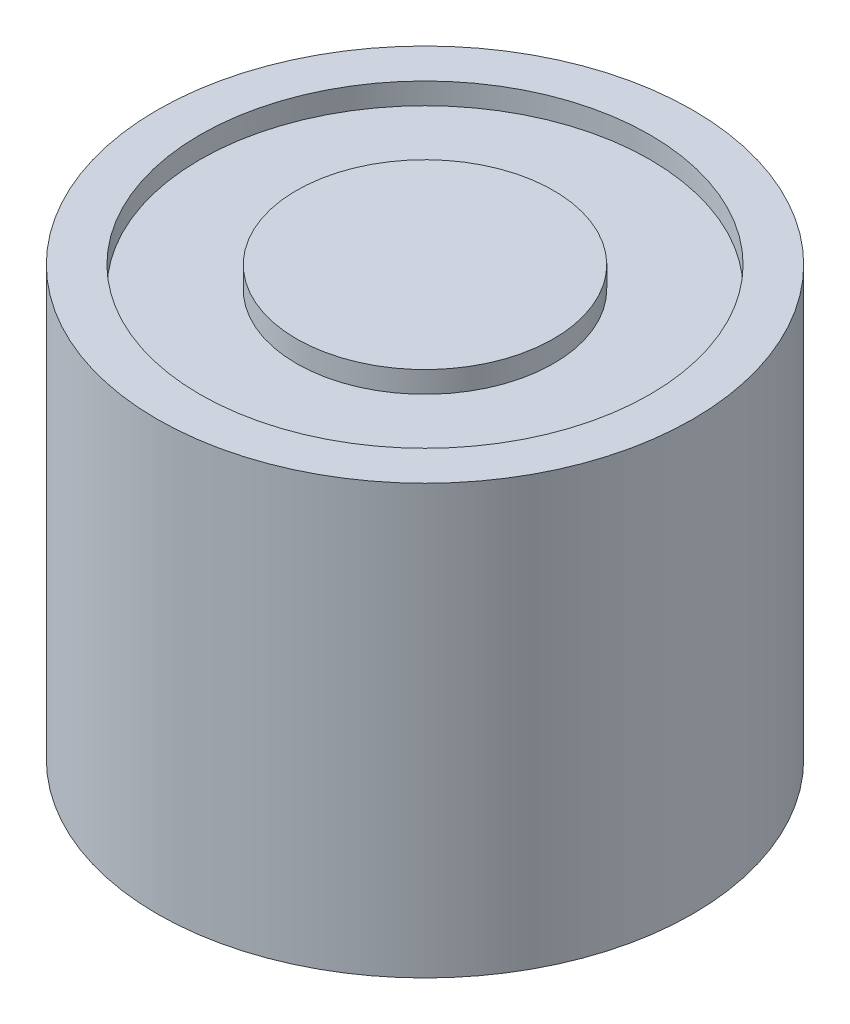
ISO-10303-21;
HEADER;
FILE_DESCRIPTION(('STEP AP214'),'2;1');
FILE_NAME('part.step','',(''),(''),'','','');
FILE_SCHEMA(('AUTOMOTIVE_DESIGN { 1 0 10303 214 1 1 1 1 }'));
ENDSEC;
DATA;
#1=APPLICATION_CONTEXT('core data for automotive mechanical design processes');
#2=APPLICATION_PROTOCOL_DEFINITION('international standard','automotive_design',2000,#1);
#3=PRODUCT_CONTEXT('',#1,'mechanical');
#4=PRODUCT('Part','Part','',(#3));
#5=PRODUCT_RELATED_PRODUCT_CATEGORY('part','',(#4));
#6=PRODUCT_DEFINITION_FORMATION('','',#4);
#7=PRODUCT_DEFINITION_CONTEXT('part definition',#1,'design');
#8=PRODUCT_DEFINITION('design','',#6,#7);
#9=PRODUCT_DEFINITION_SHAPE('','',#8);
#10=(LENGTH_UNIT() NAMED_UNIT(*) SI_UNIT(.MILLI.,.METRE.));
#11=(NAMED_UNIT(*) PLANE_ANGLE_UNIT() SI_UNIT($,.RADIAN.));
#12=(NAMED_UNIT(*) SI_UNIT($,.STERADIAN.) SOLID_ANGLE_UNIT());
#13=UNCERTAINTY_MEASURE_WITH_UNIT(LENGTH_MEASURE(1.E-05),#10,'distance_accuracy_value','');
#14=(GEOMETRIC_REPRESENTATION_CONTEXT(3) GLOBAL_UNCERTAINTY_ASSIGNED_CONTEXT((#13)) GLOBAL_UNIT_ASSIGNED_CONTEXT((#10,
#11,#12)) REPRESENTATION_CONTEXT('',''));
#15=CARTESIAN_POINT('',(0.,0.,0.));
#16=DIRECTION('',(0.,0.,1.));
#17=DIRECTION('',(1.,0.,0.));
#18=AXIS2_PLACEMENT_3D('',#15,#16,#17);
#19=CARTESIAN_POINT('',(0.,20.,0.));
#20=DIRECTION('',(0.,-1.,0.));
#21=DIRECTION('',(0.,0.,-1.));
#22=AXIS2_PLACEMENT_3D('',#19,#20,#21);
#23=CYLINDRICAL_SURFACE('',#22,12.5);
#24=CARTESIAN_POINT('',(0.,20.,0.));
#25=DIRECTION('',(0.,1.,0.));
#26=DIRECTION('',(0.,0.,1.));
#27=AXIS2_PLACEMENT_3D('',#24,#25,#26);
#28=CIRCLE('',#27,12.5);
#29=CARTESIAN_POINT('',(0.,20.,12.5));
#30=VERTEX_POINT('',#29);
#31=EDGE_CURVE('E10',#30,#30,#28,.T.);
#32=ORIENTED_EDGE('',*,*,#31,.F.);
#33=EDGE_LOOP('',(#32));
#34=FACE_BOUND('',#33,.T.);
#35=CARTESIAN_POINT('',(0.,0.,0.));
#36=DIRECTION('',(0.,1.,0.));
#37=DIRECTION('',(0.,0.,1.));
#38=AXIS2_PLACEMENT_3D('',#35,#36,#37);
#39=CIRCLE('',#38,12.5);
#40=CARTESIAN_POINT('',(0.,0.,12.5));
#41=VERTEX_POINT('',#40);
#42=EDGE_CURVE('E38',#41,#41,#39,.T.);
#43=ORIENTED_EDGE('',*,*,#42,.T.);
#44=EDGE_LOOP('',(#43));
#45=FACE_BOUND('',#44,.T.);
#46=ADVANCED_FACE('F35',(#34,#45),#23,.T.);
#47=CARTESIAN_POINT('',(0.,20.,0.));
#48=DIRECTION('',(0.,1.,0.));
#49=DIRECTION('',(0.,0.,1.));
#50=AXIS2_PLACEMENT_3D('',#47,#48,#49);
#51=PLANE('',#50);
#52=CARTESIAN_POINT('',(0.,20.,0.));
#53=DIRECTION('',(0.,1.,0.));
#54=DIRECTION('',(0.,0.,1.));
#55=AXIS2_PLACEMENT_3D('',#52,#53,#54);
#56=CIRCLE('',#55,10.5);
#57=CARTESIAN_POINT('',(0.,20.,10.5));
#58=VERTEX_POINT('',#57);
#59=EDGE_CURVE('E47',#58,#58,#56,.T.);
#60=ORIENTED_EDGE('',*,*,#59,.F.);
#61=EDGE_LOOP('',(#60));
#62=FACE_BOUND('',#61,.T.);
#63=ORIENTED_EDGE('',*,*,#31,.T.);
#64=EDGE_LOOP('',(#63));
#65=FACE_BOUND('',#64,.T.);
#66=ADVANCED_FACE('F75',(#62,#65),#51,.T.);
#67=CARTESIAN_POINT('',(0.,0.,0.));
#68=DIRECTION('',(0.,1.,0.));
#69=DIRECTION('',(0.,0.,1.));
#70=AXIS2_PLACEMENT_3D('',#67,#68,#69);
#71=PLANE('',#70);
#72=ORIENTED_EDGE('',*,*,#42,.F.);
#73=EDGE_LOOP('',(#72));
#74=FACE_BOUND('',#73,.T.);
#75=ADVANCED_FACE('F71',(#74),#71,.F.);
#76=CARTESIAN_POINT('',(0.,19.,0.));
#77=DIRECTION('',(0.,1.,0.));
#78=DIRECTION('',(0.,0.,1.));
#79=AXIS2_PLACEMENT_3D('',#76,#77,#78);
#80=CYLINDRICAL_SURFACE('',#79,10.5);
#81=CARTESIAN_POINT('',(0.,19.,0.));
#82=DIRECTION('',(0.,1.,0.));
#83=DIRECTION('',(0.,0.,1.));
#84=AXIS2_PLACEMENT_3D('',#81,#82,#83);
#85=CIRCLE('',#84,10.5);
#86=CARTESIAN_POINT('',(0.,19.,10.5));
#87=VERTEX_POINT('',#86);
#88=EDGE_CURVE('E45',#87,#87,#85,.T.);
#89=ORIENTED_EDGE('',*,*,#88,.F.);
#90=EDGE_LOOP('',(#89));
#91=FACE_BOUND('',#90,.T.);
#92=ORIENTED_EDGE('',*,*,#59,.T.);
#93=EDGE_LOOP('',(#92));
#94=FACE_BOUND('',#93,.T.);
#95=ADVANCED_FACE('F65',(#91,#94),#80,.F.);
#96=CARTESIAN_POINT('',(0.,19.,0.));
#97=DIRECTION('',(0.,1.,0.));
#98=DIRECTION('',(0.,0.,1.));
#99=AXIS2_PLACEMENT_3D('',#96,#97,#98);
#100=PLANE('',#99);
#101=CARTESIAN_POINT('',(0.,19.,0.));
#102=DIRECTION('',(0.,1.,0.));
#103=DIRECTION('',(0.,0.,1.));
#104=AXIS2_PLACEMENT_3D('',#101,#102,#103);
#105=CIRCLE('',#104,6.);
#106=CARTESIAN_POINT('',(0.,19.,6.));
#107=VERTEX_POINT('',#106);
#108=EDGE_CURVE('E50',#107,#107,#105,.T.);
#109=ORIENTED_EDGE('',*,*,#108,.F.);
#110=EDGE_LOOP('',(#109));
#111=FACE_BOUND('',#110,.T.);
#112=ORIENTED_EDGE('',*,*,#88,.T.);
#113=EDGE_LOOP('',(#112));
#114=FACE_BOUND('',#113,.T.);
#115=ADVANCED_FACE('F62',(#111,#114),#100,.T.);
#116=CARTESIAN_POINT('',(0.,19.,0.));
#117=DIRECTION('',(0.,1.,0.));
#118=DIRECTION('',(0.,0.,1.));
#119=AXIS2_PLACEMENT_3D('',#116,#117,#118);
#120=CYLINDRICAL_SURFACE('',#119,6.);
#121=ORIENTED_EDGE('',*,*,#108,.T.);
#122=EDGE_LOOP('',(#121));
#123=FACE_BOUND('',#122,.T.);
#124=CARTESIAN_POINT('',(0.,20.,0.));
#125=DIRECTION('',(0.,1.,0.));
#126=DIRECTION('',(0.,0.,1.));
#127=AXIS2_PLACEMENT_3D('',#124,#125,#126);
#128=CIRCLE('',#127,6.);
#129=CARTESIAN_POINT('',(0.,20.,6.));
#130=VERTEX_POINT('',#129);
#131=EDGE_CURVE('E53',#130,#130,#128,.T.);
#132=ORIENTED_EDGE('',*,*,#131,.F.);
#133=EDGE_LOOP('',(#132));
#134=FACE_BOUND('',#133,.T.);
#135=ADVANCED_FACE('F59',(#123,#134),#120,.T.);
#136=ORIENTED_EDGE('',*,*,#131,.T.);
#137=EDGE_LOOP('',(#136));
#138=FACE_BOUND('',#137,.T.);
#139=ADVANCED_FACE('F78',(#138),#51,.T.);
#140=CLOSED_SHELL('',(#46,#66,#75,#95,#115,#135,#139));
#141=MANIFOLD_SOLID_BREP('B2',#140);
#142=ADVANCED_BREP_SHAPE_REPRESENTATION('',(#18,#141),#14);
#143=SHAPE_DEFINITION_REPRESENTATION(#9,#142);
ENDSEC;
END-ISO-10303-21;
